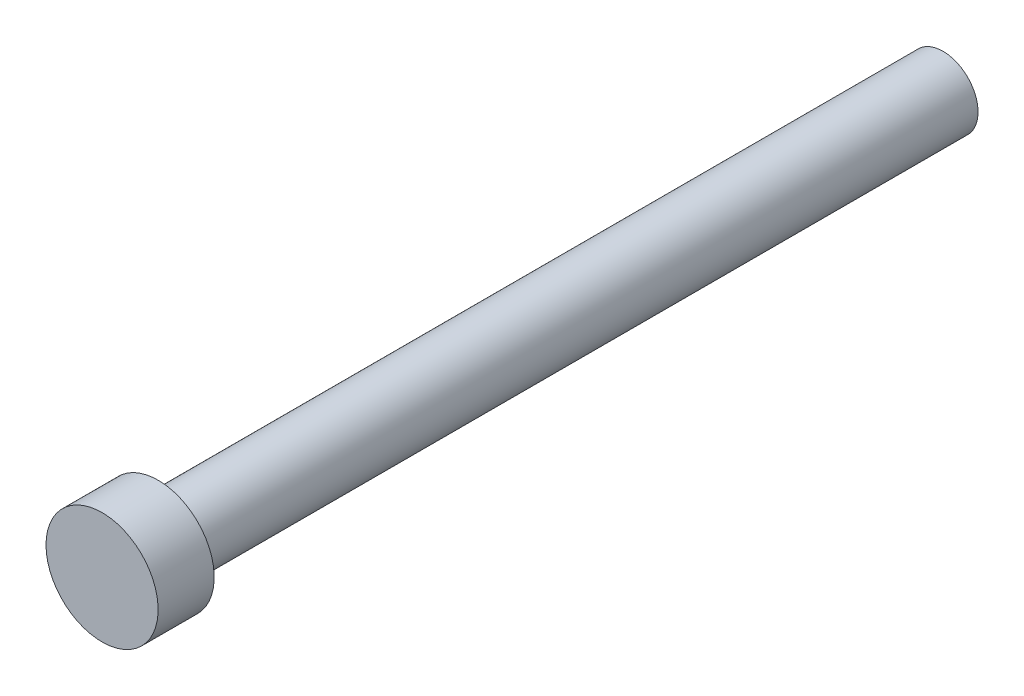
ISO-10303-21;
HEADER;
FILE_DESCRIPTION(('STEP AP214'),'2;1');
FILE_NAME('part.step','',(''),(''),'','','');
FILE_SCHEMA(('AUTOMOTIVE_DESIGN { 1 0 10303 214 1 1 1 1 }'));
ENDSEC;
DATA;
#1=APPLICATION_CONTEXT('core data for automotive mechanical design processes');
#2=APPLICATION_PROTOCOL_DEFINITION('international standard','automotive_design',2000,#1);
#3=PRODUCT_CONTEXT('',#1,'mechanical');
#4=PRODUCT('Part','Part','',(#3));
#5=PRODUCT_RELATED_PRODUCT_CATEGORY('part','',(#4));
#6=PRODUCT_DEFINITION_FORMATION('','',#4);
#7=PRODUCT_DEFINITION_CONTEXT('part definition',#1,'design');
#8=PRODUCT_DEFINITION('design','',#6,#7);
#9=PRODUCT_DEFINITION_SHAPE('','',#8);
#10=(LENGTH_UNIT() NAMED_UNIT(*) SI_UNIT(.MILLI.,.METRE.));
#11=(NAMED_UNIT(*) PLANE_ANGLE_UNIT() SI_UNIT($,.RADIAN.));
#12=(NAMED_UNIT(*) SI_UNIT($,.STERADIAN.) SOLID_ANGLE_UNIT());
#13=UNCERTAINTY_MEASURE_WITH_UNIT(LENGTH_MEASURE(1.E-05),#10,'distance_accuracy_value','');
#14=(GEOMETRIC_REPRESENTATION_CONTEXT(3) GLOBAL_UNCERTAINTY_ASSIGNED_CONTEXT((#13)) GLOBAL_UNIT_ASSIGNED_CONTEXT((#10,
#11,#12)) REPRESENTATION_CONTEXT('',''));
#15=CARTESIAN_POINT('',(0.,0.,0.));
#16=DIRECTION('',(0.,0.,1.));
#17=DIRECTION('',(1.,0.,0.));
#18=AXIS2_PLACEMENT_3D('',#15,#16,#17);
#19=CARTESIAN_POINT('',(0.,0.,76.2));
#20=DIRECTION('',(0.,0.,-1.));
#21=DIRECTION('',(-1.,0.,0.));
#22=AXIS2_PLACEMENT_3D('',#19,#20,#21);
#23=CYLINDRICAL_SURFACE('',#22,5.08);
#24=CARTESIAN_POINT('',(0.,0.,76.2));
#25=DIRECTION('',(0.,0.,-1.));
#26=DIRECTION('',(-1.,0.,0.));
#27=AXIS2_PLACEMENT_3D('',#24,#25,#26);
#28=CIRCLE('',#27,5.08);
#29=CARTESIAN_POINT('',(-5.08000000000001,0.,76.2));
#30=VERTEX_POINT('',#29);
#31=EDGE_CURVE('E10',#30,#30,#28,.T.);
#32=ORIENTED_EDGE('',*,*,#31,.T.);
#33=EDGE_LOOP('',(#32));
#34=FACE_BOUND('',#33,.T.);
#35=CARTESIAN_POINT('',(0.,0.,71.12));
#36=DIRECTION('',(0.,0.,-1.));
#37=DIRECTION('',(-1.,0.,0.));
#38=AXIS2_PLACEMENT_3D('',#35,#36,#37);
#39=CIRCLE('',#38,5.08);
#40=CARTESIAN_POINT('',(-5.08000000000001,0.,71.12));
#41=VERTEX_POINT('',#40);
#42=EDGE_CURVE('E45',#41,#41,#39,.T.);
#43=ORIENTED_EDGE('',*,*,#42,.F.);
#44=EDGE_LOOP('',(#43));
#45=FACE_BOUND('',#44,.T.);
#46=ADVANCED_FACE('F31',(#34,#45),#23,.T.);
#47=CARTESIAN_POINT('',(5.07999999999999,0.,76.2));
#48=DIRECTION('',(0.,0.,1.));
#49=DIRECTION('',(1.,0.,0.));
#50=AXIS2_PLACEMENT_3D('',#47,#48,#49);
#51=PLANE('',#50);
#52=ORIENTED_EDGE('',*,*,#31,.F.);
#53=EDGE_LOOP('',(#52));
#54=FACE_BOUND('',#53,.T.);
#55=ADVANCED_FACE('F55',(#54),#51,.T.);
#56=CARTESIAN_POINT('',(0.,0.,0.));
#57=DIRECTION('',(0.,0.,-1.));
#58=DIRECTION('',(-1.,0.,0.));
#59=AXIS2_PLACEMENT_3D('',#56,#57,#58);
#60=PLANE('',#59);
#61=CARTESIAN_POINT('',(0.,0.,0.));
#62=DIRECTION('',(0.,0.,-1.));
#63=DIRECTION('',(-1.,0.,0.));
#64=AXIS2_PLACEMENT_3D('',#61,#62,#63);
#65=CIRCLE('',#64,3.175);
#66=CARTESIAN_POINT('',(-3.175,0.,0.));
#67=VERTEX_POINT('',#66);
#68=EDGE_CURVE('E37',#67,#67,#65,.T.);
#69=ORIENTED_EDGE('',*,*,#68,.T.);
#70=EDGE_LOOP('',(#69));
#71=FACE_BOUND('',#70,.T.);
#72=ADVANCED_FACE('F59',(#71),#60,.T.);
#73=CARTESIAN_POINT('',(0.,0.,76.2));
#74=DIRECTION('',(0.,0.,-1.));
#75=DIRECTION('',(-1.,0.,0.));
#76=AXIS2_PLACEMENT_3D('',#73,#74,#75);
#77=CYLINDRICAL_SURFACE('',#76,3.175);
#78=CARTESIAN_POINT('',(0.,0.,71.12));
#79=DIRECTION('',(0.,0.,-1.));
#80=DIRECTION('',(-1.,0.,0.));
#81=AXIS2_PLACEMENT_3D('',#78,#79,#80);
#82=CIRCLE('',#81,3.17500000000001);
#83=CARTESIAN_POINT('',(-3.17500000000002,0.,71.12));
#84=VERTEX_POINT('',#83);
#85=EDGE_CURVE('E41',#84,#84,#82,.T.);
#86=ORIENTED_EDGE('',*,*,#85,.T.);
#87=EDGE_LOOP('',(#86));
#88=FACE_BOUND('',#87,.T.);
#89=ORIENTED_EDGE('',*,*,#68,.F.);
#90=EDGE_LOOP('',(#89));
#91=FACE_BOUND('',#90,.T.);
#92=ADVANCED_FACE('F64',(#88,#91),#77,.T.);
#93=CARTESIAN_POINT('',(3.175,0.,71.12));
#94=DIRECTION('',(0.,0.,-1.));
#95=DIRECTION('',(-1.,0.,0.));
#96=AXIS2_PLACEMENT_3D('',#93,#94,#95);
#97=PLANE('',#96);
#98=ORIENTED_EDGE('',*,*,#42,.T.);
#99=EDGE_LOOP('',(#98));
#100=FACE_BOUND('',#99,.T.);
#101=ORIENTED_EDGE('',*,*,#85,.F.);
#102=EDGE_LOOP('',(#101));
#103=FACE_BOUND('',#102,.T.);
#104=ADVANCED_FACE('F51',(#100,#103),#97,.T.);
#105=CLOSED_SHELL('',(#46,#55,#72,#92,#104));
#106=MANIFOLD_SOLID_BREP('B2',#105);
#107=ADVANCED_BREP_SHAPE_REPRESENTATION('',(#18,#106),#14);
#108=SHAPE_DEFINITION_REPRESENTATION(#9,#107);
ENDSEC;
END-ISO-10303-21;
